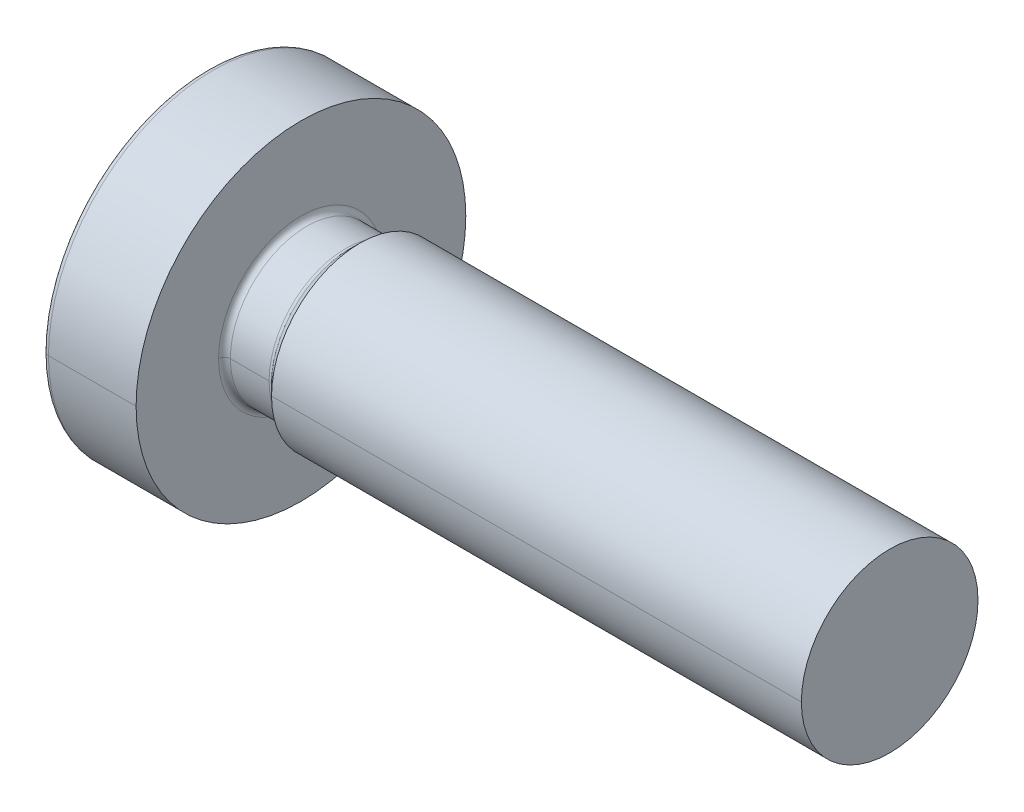
ISO-10303-21;
HEADER;
FILE_DESCRIPTION(('STEP AP214'),'2;1');
FILE_NAME('part.step','',(''),(''),'','','');
FILE_SCHEMA(('AUTOMOTIVE_DESIGN { 1 0 10303 214 1 1 1 1 }'));
ENDSEC;
DATA;
#1=APPLICATION_CONTEXT('core data for automotive mechanical design processes');
#2=APPLICATION_PROTOCOL_DEFINITION('international standard','automotive_design',2000,#1);
#3=PRODUCT_CONTEXT('',#1,'mechanical');
#4=PRODUCT('Part','Part','',(#3));
#5=PRODUCT_RELATED_PRODUCT_CATEGORY('part','',(#4));
#6=PRODUCT_DEFINITION_FORMATION('','',#4);
#7=PRODUCT_DEFINITION_CONTEXT('part definition',#1,'design');
#8=PRODUCT_DEFINITION('design','',#6,#7);
#9=PRODUCT_DEFINITION_SHAPE('','',#8);
#10=(LENGTH_UNIT() NAMED_UNIT(*) SI_UNIT(.MILLI.,.METRE.));
#11=(NAMED_UNIT(*) PLANE_ANGLE_UNIT() SI_UNIT($,.RADIAN.));
#12=(NAMED_UNIT(*) SI_UNIT($,.STERADIAN.) SOLID_ANGLE_UNIT());
#13=UNCERTAINTY_MEASURE_WITH_UNIT(LENGTH_MEASURE(1.E-05),#10,'distance_accuracy_value','');
#14=(GEOMETRIC_REPRESENTATION_CONTEXT(3) GLOBAL_UNCERTAINTY_ASSIGNED_CONTEXT((#13)) GLOBAL_UNIT_ASSIGNED_CONTEXT((#10,
#11,#12)) REPRESENTATION_CONTEXT('',''));
#15=CARTESIAN_POINT('',(0.,0.,0.));
#16=DIRECTION('',(0.,0.,1.));
#17=DIRECTION('',(1.,0.,0.));
#18=AXIS2_PLACEMENT_3D('',#15,#16,#17);
#19=CARTESIAN_POINT('',(2.5,0.,0.));
#20=DIRECTION('',(-1.,0.,0.));
#21=DIRECTION('',(0.,0.,1.));
#22=AXIS2_PLACEMENT_3D('',#19,#20,#21);
#23=TOROIDAL_SURFACE('',#22,1.399,0.1);
#24=CARTESIAN_POINT('',(2.4,0.,0.));
#25=DIRECTION('',(-1.,0.,0.));
#26=DIRECTION('',(0.,0.,1.));
#27=AXIS2_PLACEMENT_3D('',#24,#25,#26);
#28=CIRCLE('',#27,1.399);
#29=CARTESIAN_POINT('',(2.4,0.,-1.399));
#30=VERTEX_POINT('',#29);
#31=CARTESIAN_POINT('',(2.4,0.,1.399));
#32=VERTEX_POINT('',#31);
#33=EDGE_CURVE('E19',#30,#32,#28,.T.);
#34=ORIENTED_EDGE('',*,*,#33,.F.);
#35=CARTESIAN_POINT('',(2.5,0.,-1.399));
#36=DIRECTION('',(0.,1.,0.));
#37=DIRECTION('',(0.,0.,1.));
#38=AXIS2_PLACEMENT_3D('',#35,#36,#37);
#39=CIRCLE('',#38,0.1);
#40=CARTESIAN_POINT('',(2.5,0.,-1.299));
#41=VERTEX_POINT('',#40);
#42=EDGE_CURVE('E10',#30,#41,#39,.T.);
#43=ORIENTED_EDGE('',*,*,#42,.T.);
#44=CARTESIAN_POINT('',(2.5,0.,0.));
#45=DIRECTION('',(1.,0.,0.));
#46=DIRECTION('',(0.,0.,1.));
#47=AXIS2_PLACEMENT_3D('',#44,#45,#46);
#48=CIRCLE('',#47,1.299);
#49=CARTESIAN_POINT('',(2.5,0.,1.299));
#50=VERTEX_POINT('',#49);
#51=EDGE_CURVE('E231',#50,#41,#48,.T.);
#52=ORIENTED_EDGE('',*,*,#51,.F.);
#53=CARTESIAN_POINT('',(2.5,0.,1.399));
#54=DIRECTION('',(0.,-1.,0.));
#55=DIRECTION('',(0.,0.,-1.));
#56=AXIS2_PLACEMENT_3D('',#53,#54,#55);
#57=CIRCLE('',#56,0.1);
#58=EDGE_CURVE('E436',#32,#50,#57,.T.);
#59=ORIENTED_EDGE('',*,*,#58,.F.);
#60=EDGE_LOOP('',(#34,#43,#52,#59));
#61=FACE_BOUND('',#60,.T.);
#62=ADVANCED_FACE('F15',(#61),#23,.F.);
#63=CARTESIAN_POINT('',(3.15757864376269,0.,0.));
#64=DIRECTION('',(-1.,0.,0.));
#65=DIRECTION('',(0.,0.,1.));
#66=AXIS2_PLACEMENT_3D('',#63,#64,#65);
#67=TOROIDAL_SURFACE('',#66,1.399,0.1);
#68=CARTESIAN_POINT('',(3.15757864376269,0.,0.));
#69=DIRECTION('',(-1.,0.,0.));
#70=DIRECTION('',(0.,0.,1.));
#71=AXIS2_PLACEMENT_3D('',#68,#69,#70);
#72=CIRCLE('',#71,1.299);
#73=CARTESIAN_POINT('',(3.15757864376269,0.,-1.299));
#74=VERTEX_POINT('',#73);
#75=CARTESIAN_POINT('',(3.15757864376269,0.,1.299));
#76=VERTEX_POINT('',#75);
#77=EDGE_CURVE('E230',#74,#76,#72,.T.);
#78=ORIENTED_EDGE('',*,*,#77,.F.);
#79=CARTESIAN_POINT('',(3.15757864376269,0.,-1.399));
#80=DIRECTION('',(0.,1.,0.));
#81=DIRECTION('',(0.,0.,1.));
#82=AXIS2_PLACEMENT_3D('',#79,#80,#81);
#83=CIRCLE('',#82,0.1);
#84=CARTESIAN_POINT('',(3.22828932188135,0.,-1.32828932188134));
#85=VERTEX_POINT('',#84);
#86=EDGE_CURVE('E26',#74,#85,#83,.T.);
#87=ORIENTED_EDGE('',*,*,#86,.T.);
#88=CARTESIAN_POINT('',(3.22828932188135,0.,0.));
#89=DIRECTION('',(1.,0.,0.));
#90=DIRECTION('',(0.,0.,-1.));
#91=AXIS2_PLACEMENT_3D('',#88,#89,#90);
#92=CIRCLE('',#91,1.32828932188134);
#93=CARTESIAN_POINT('',(3.22828932188135,0.,1.32828932188134));
#94=VERTEX_POINT('',#93);
#95=EDGE_CURVE('E262',#94,#85,#92,.T.);
#96=ORIENTED_EDGE('',*,*,#95,.F.);
#97=CARTESIAN_POINT('',(3.15757864376269,0.,1.399));
#98=DIRECTION('',(0.,-1.,0.));
#99=DIRECTION('',(0.,0.,-1.));
#100=AXIS2_PLACEMENT_3D('',#97,#98,#99);
#101=CIRCLE('',#100,0.1);
#102=EDGE_CURVE('E297',#76,#94,#101,.T.);
#103=ORIENTED_EDGE('',*,*,#102,.F.);
#104=EDGE_LOOP('',(#78,#87,#96,#103));
#105=FACE_BOUND('',#104,.T.);
#106=ADVANCED_FACE('F583',(#105),#67,.F.);
#107=CARTESIAN_POINT('',(0.910990339947826,0.,0.));
#108=DIRECTION('',(1.,0.,0.));
#109=DIRECTION('',(0.,0.,-1.));
#110=AXIS2_PLACEMENT_3D('',#107,#108,#109);
#111=TOROIDAL_SURFACE('',#110,2.7,0.1);
#112=CARTESIAN_POINT('',(0.827541163212067,0.,0.));
#113=DIRECTION('',(-1.,0.,0.));
#114=DIRECTION('',(0.,0.,-1.));
#115=AXIS2_PLACEMENT_3D('',#112,#113,#114);
#116=CIRCLE('',#115,2.75510204081632);
#117=CARTESIAN_POINT('',(0.827541163212067,0.,2.75510204081632));
#118=VERTEX_POINT('',#117);
#119=CARTESIAN_POINT('',(0.827541163212066,2.75510204081632,0.));
#120=VERTEX_POINT('',#119);
#121=EDGE_CURVE('E388',#118,#120,#116,.T.);
#122=ORIENTED_EDGE('',*,*,#121,.F.);
#123=CARTESIAN_POINT('',(0.910990339947826,0.,2.7));
#124=DIRECTION('',(0.,1.,0.));
#125=DIRECTION('',(0.,0.,1.));
#126=AXIS2_PLACEMENT_3D('',#123,#124,#125);
#127=CIRCLE('',#126,0.1);
#128=CARTESIAN_POINT('',(0.910990339947826,0.,2.8));
#129=VERTEX_POINT('',#128);
#130=EDGE_CURVE('E285',#118,#129,#127,.T.);
#131=ORIENTED_EDGE('',*,*,#130,.T.);
#132=CARTESIAN_POINT('',(0.910990339947826,0.,0.));
#133=DIRECTION('',(1.,0.,0.));
#134=DIRECTION('',(0.,0.,-1.));
#135=AXIS2_PLACEMENT_3D('',#132,#133,#134);
#136=CIRCLE('',#135,2.8);
#137=CARTESIAN_POINT('',(0.910990339947826,0.,-2.8));
#138=VERTEX_POINT('',#137);
#139=EDGE_CURVE('E353',#138,#129,#136,.T.);
#140=ORIENTED_EDGE('',*,*,#139,.F.);
#141=CARTESIAN_POINT('',(0.910990339947826,0.,-2.7));
#142=DIRECTION('',(0.,-1.,0.));
#143=DIRECTION('',(0.,0.,-1.));
#144=AXIS2_PLACEMENT_3D('',#141,#142,#143);
#145=CIRCLE('',#144,0.1);
#146=CARTESIAN_POINT('',(0.827541163212067,0.,-2.75510204081632));
#147=VERTEX_POINT('',#146);
#148=EDGE_CURVE('E293',#147,#138,#145,.T.);
#149=ORIENTED_EDGE('',*,*,#148,.F.);
#150=CARTESIAN_POINT('',(0.827541163212067,0.,0.));
#151=DIRECTION('',(-1.,0.,0.));
#152=DIRECTION('',(0.,0.,-1.));
#153=AXIS2_PLACEMENT_3D('',#150,#151,#152);
#154=CIRCLE('',#153,2.75510204081632);
#155=EDGE_CURVE('E368',#120,#147,#154,.T.);
#156=ORIENTED_EDGE('',*,*,#155,.F.);
#157=EDGE_LOOP('',(#122,#131,#140,#149,#156));
#158=FACE_BOUND('',#157,.T.);
#159=ADVANCED_FACE('F588',(#158),#111,.T.);
#160=CARTESIAN_POINT('',(-3.4420013783492,0.,0.));
#161=DIRECTION('',(-1.,0.,0.));
#162=DIRECTION('',(0.,0.,1.));
#163=AXIS2_PLACEMENT_3D('',#160,#161,#162);
#164=CYLINDRICAL_SURFACE('',#163,1.5);
#165=CARTESIAN_POINT('',(12.4,0.,0.));
#166=DIRECTION('',(-1.,0.,0.));
#167=DIRECTION('',(0.,0.,1.));
#168=AXIS2_PLACEMENT_3D('',#165,#166,#167);
#169=CIRCLE('',#168,1.5);
#170=CARTESIAN_POINT('',(12.4,0.,1.5));
#171=VERTEX_POINT('',#170);
#172=CARTESIAN_POINT('',(12.4,0.,-1.5));
#173=VERTEX_POINT('',#172);
#174=EDGE_CURVE('E281',#171,#173,#169,.T.);
#175=ORIENTED_EDGE('',*,*,#174,.T.);
#176=DIRECTION('',(-1.,0.,0.));
#177=VECTOR('',#176,1.);
#178=CARTESIAN_POINT('',(-3.4420013783492,0.,-1.5));
#179=LINE('',#178,#177);
#180=CARTESIAN_POINT('',(3.4,0.,-1.5));
#181=VERTEX_POINT('',#180);
#182=EDGE_CURVE('E286',#173,#181,#179,.T.);
#183=ORIENTED_EDGE('',*,*,#182,.T.);
#184=CARTESIAN_POINT('',(3.4,0.,0.));
#185=DIRECTION('',(-1.,0.,0.));
#186=DIRECTION('',(0.,0.,1.));
#187=AXIS2_PLACEMENT_3D('',#184,#185,#186);
#188=CIRCLE('',#187,1.5);
#189=CARTESIAN_POINT('',(3.4,0.,1.5));
#190=VERTEX_POINT('',#189);
#191=EDGE_CURVE('E247',#190,#181,#188,.T.);
#192=ORIENTED_EDGE('',*,*,#191,.F.);
#193=DIRECTION('',(-1.,0.,0.));
#194=VECTOR('',#193,1.);
#195=CARTESIAN_POINT('',(-3.4420013783492,0.,1.5));
#196=LINE('',#195,#194);
#197=EDGE_CURVE('E296',#171,#190,#196,.T.);
#198=ORIENTED_EDGE('',*,*,#197,.F.);
#199=EDGE_LOOP('',(#175,#183,#192,#198));
#200=FACE_BOUND('',#199,.T.);
#201=ADVANCED_FACE('F608',(#200),#164,.T.);
#202=CARTESIAN_POINT('',(3.4,0.,0.));
#203=DIRECTION('',(1.,0.,0.));
#204=DIRECTION('',(0.,0.,-1.));
#205=AXIS2_PLACEMENT_3D('',#202,#203,#204);
#206=CONICAL_SURFACE('',#205,1.5,0.78539816339744);
#207=CARTESIAN_POINT('',(3.22828932188135,0.,0.));
#208=DIRECTION('',(1.,0.,0.));
#209=DIRECTION('',(0.,0.,-1.));
#210=AXIS2_PLACEMENT_3D('',#207,#208,#209);
#211=CIRCLE('',#210,1.32828932188134);
#212=EDGE_CURVE('E323',#85,#94,#211,.T.);
#213=ORIENTED_EDGE('',*,*,#212,.T.);
#214=DIRECTION('',(0.707106781186554,0.,0.707106781186541));
#215=VECTOR('',#214,1.);
#216=CARTESIAN_POINT('',(3.4,0.,1.5));
#217=LINE('',#216,#215);
#218=EDGE_CURVE('E251',#94,#190,#217,.T.);
#219=ORIENTED_EDGE('',*,*,#218,.T.);
#220=ORIENTED_EDGE('',*,*,#191,.T.);
#221=DIRECTION('',(0.707106781186554,0.,-0.707106781186541));
#222=VECTOR('',#221,1.);
#223=CARTESIAN_POINT('',(3.4,0.,-1.5));
#224=LINE('',#223,#222);
#225=EDGE_CURVE('E259',#85,#181,#224,.T.);
#226=ORIENTED_EDGE('',*,*,#225,.F.);
#227=EDGE_LOOP('',(#213,#219,#220,#226));
#228=FACE_BOUND('',#227,.T.);
#229=ADVANCED_FACE('F604',(#228),#206,.T.);
#230=CARTESIAN_POINT('',(-3.4420013783492,0.,0.));
#231=DIRECTION('',(-1.,0.,0.));
#232=DIRECTION('',(0.,0.,1.));
#233=AXIS2_PLACEMENT_3D('',#230,#231,#232);
#234=CYLINDRICAL_SURFACE('',#233,1.299);
#235=CARTESIAN_POINT('',(3.15757864376269,0.,0.));
#236=DIRECTION('',(-1.,0.,0.));
#237=DIRECTION('',(0.,0.,1.));
#238=AXIS2_PLACEMENT_3D('',#235,#236,#237);
#239=CIRCLE('',#238,1.299);
#240=EDGE_CURVE('E252',#76,#74,#239,.T.);
#241=ORIENTED_EDGE('',*,*,#240,.T.);
#242=DIRECTION('',(-1.,0.,0.));
#243=VECTOR('',#242,1.);
#244=CARTESIAN_POINT('',(-3.4420013783492,0.,-1.299));
#245=LINE('',#244,#243);
#246=EDGE_CURVE('E328',#74,#41,#245,.T.);
#247=ORIENTED_EDGE('',*,*,#246,.T.);
#248=CARTESIAN_POINT('',(2.5,0.,0.));
#249=DIRECTION('',(1.,0.,0.));
#250=DIRECTION('',(0.,0.,1.));
#251=AXIS2_PLACEMENT_3D('',#248,#249,#250);
#252=CIRCLE('',#251,1.299);
#253=EDGE_CURVE('E324',#41,#50,#252,.T.);
#254=ORIENTED_EDGE('',*,*,#253,.T.);
#255=DIRECTION('',(-1.,0.,0.));
#256=VECTOR('',#255,1.);
#257=CARTESIAN_POINT('',(-3.4420013783492,0.,1.299));
#258=LINE('',#257,#256);
#259=EDGE_CURVE('E226',#76,#50,#258,.T.);
#260=ORIENTED_EDGE('',*,*,#259,.F.);
#261=EDGE_LOOP('',(#241,#247,#254,#260));
#262=FACE_BOUND('',#261,.T.);
#263=ADVANCED_FACE('F607',(#262),#234,.T.);
#264=CARTESIAN_POINT('',(-3.4420013783492,0.,0.));
#265=DIRECTION('',(-1.,0.,0.));
#266=DIRECTION('',(0.,0.,1.));
#267=AXIS2_PLACEMENT_3D('',#264,#265,#266);
#268=CYLINDRICAL_SURFACE('',#267,2.8);
#269=CARTESIAN_POINT('',(2.4,0.,0.));
#270=DIRECTION('',(-1.,0.,0.));
#271=DIRECTION('',(0.,0.,1.));
#272=AXIS2_PLACEMENT_3D('',#269,#270,#271);
#273=CIRCLE('',#272,2.8);
#274=CARTESIAN_POINT('',(2.4,0.,2.8));
#275=VERTEX_POINT('',#274);
#276=CARTESIAN_POINT('',(2.4,0.,-2.8));
#277=VERTEX_POINT('',#276);
#278=EDGE_CURVE('E329',#275,#277,#273,.T.);
#279=ORIENTED_EDGE('',*,*,#278,.T.);
#280=DIRECTION('',(-1.,0.,0.));
#281=VECTOR('',#280,1.);
#282=CARTESIAN_POINT('',(-3.4420013783492,0.,-2.8));
#283=LINE('',#282,#281);
#284=EDGE_CURVE('E349',#277,#138,#283,.T.);
#285=ORIENTED_EDGE('',*,*,#284,.T.);
#286=ORIENTED_EDGE('',*,*,#139,.T.);
#287=DIRECTION('',(-1.,0.,0.));
#288=VECTOR('',#287,1.);
#289=CARTESIAN_POINT('',(-3.4420013783492,0.,2.8));
#290=LINE('',#289,#288);
#291=EDGE_CURVE('E305',#275,#129,#290,.T.);
#292=ORIENTED_EDGE('',*,*,#291,.F.);
#293=EDGE_LOOP('',(#279,#285,#286,#292));
#294=FACE_BOUND('',#293,.T.);
#295=ADVANCED_FACE('F667',(#294),#268,.T.);
#296=CARTESIAN_POINT('',(5.,0.,0.));
#297=DIRECTION('',(0.,0.,-1.));
#298=DIRECTION('',(0.,1.,0.));
#299=AXIS2_PLACEMENT_3D('',#296,#297,#298);
#300=SPHERICAL_SURFACE('',#299,5.);
#301=ORIENTED_EDGE('',*,*,#155,.T.);
#302=CARTESIAN_POINT('',(0.827541163212067,0.,0.));
#303=DIRECTION('',(-1.,0.,0.));
#304=DIRECTION('',(0.,0.,-1.));
#305=AXIS2_PLACEMENT_3D('',#302,#303,#304);
#306=CIRCLE('',#305,2.75510204081632);
#307=CARTESIAN_POINT('',(0.827541163212066,-2.75510204081632,0.));
#308=VERTEX_POINT('',#307);
#309=EDGE_CURVE('E279',#147,#308,#306,.T.);
#310=ORIENTED_EDGE('',*,*,#309,.T.);
#311=CARTESIAN_POINT('',(5.,0.,0.));
#312=DIRECTION('',(0.,0.,-1.));
#313=DIRECTION('',(0.,1.,0.));
#314=AXIS2_PLACEMENT_3D('',#311,#312,#313);
#315=CIRCLE('',#314,5.);
#316=CARTESIAN_POINT('',(0.0483882559325496,-0.693931650822548,0.));
#317=VERTEX_POINT('',#316);
#318=EDGE_CURVE('E275',#308,#317,#315,.T.);
#319=ORIENTED_EDGE('',*,*,#318,.T.);
#320=CARTESIAN_POINT('',(5.00907871968526,-0.073940238239228,0.0283829982019893));
#321=DIRECTION('',(0.113883497498907,-0.927506656060475,0.356036447517571));
#322=DIRECTION('',(0.,-0.358367949545293,-0.933580426497205));
#323=AXIS2_PLACEMENT_3D('',#320,#321,#322);
#324=CIRCLE('',#323,4.9993644419497);
#325=CARTESIAN_POINT('',(0.0743133377131422,-0.805315831954644,-0.298458231192017));
#326=VERTEX_POINT('',#325);
#327=EDGE_CURVE('E280',#317,#326,#324,.T.);
#328=ORIENTED_EDGE('',*,*,#327,.T.);
#329=CARTESIAN_POINT('',(4.99447111284247,0.0450291723721179,-0.0434841662986069));
#330=DIRECTION('',(0.0879813128153511,-0.716550290756221,0.691964572368025));
#331=DIRECTION('',(0.,-0.694658370458996,-0.719339800338653));
#332=AXIS2_PLACEMENT_3D('',#329,#330,#331);
#333=CIRCLE('',#332,4.99960507763599);
#334=CARTESIAN_POINT('',(0.212229293358308,-1.22830113216143,-0.754007950458526));
#335=VERTEX_POINT('',#334);
#336=EDGE_CURVE('E291',#326,#335,#333,.T.);
#337=ORIENTED_EDGE('',*,*,#336,.T.);
#338=CARTESIAN_POINT('',(4.60651618361134,0.558053223935769,0.55805322393577));
#339=DIRECTION('',(-0.446197814505031,0.632814155313759,0.63281415531376));
#340=DIRECTION('',(0.,-0.707106781186548,0.707106781186547));
#341=AXIS2_PLACEMENT_3D('',#338,#339,#340);
#342=CIRCLE('',#341,4.92161799459791);
#343=CARTESIAN_POINT('',(0.212229294438488,-0.754007950138534,-1.22830113171978));
#344=VERTEX_POINT('',#343);
#345=EDGE_CURVE('E417',#344,#335,#342,.T.);
#346=ORIENTED_EDGE('',*,*,#345,.F.);
#347=CARTESIAN_POINT('',(4.99447111284247,-0.0434841662986056,0.0450291723721165));
#348=DIRECTION('',(0.0879813128153507,0.691964572368025,-0.716550290756221));
#349=DIRECTION('',(0.,0.719339800338653,0.694658370458996));
#350=AXIS2_PLACEMENT_3D('',#347,#348,#349);
#351=CIRCLE('',#350,4.99960507763599);
#352=CARTESIAN_POINT('',(0.0743133377131075,-0.298458231192018,-0.805315831954648));
#353=VERTEX_POINT('',#352);
#354=EDGE_CURVE('E287',#344,#353,#351,.T.);
#355=ORIENTED_EDGE('',*,*,#354,.T.);
#356=CARTESIAN_POINT('',(5.00907871968526,0.0283829982019898,-0.0739402382392289));
#357=DIRECTION('',(0.113883497498906,0.356036447517571,-0.927506656060475));
#358=DIRECTION('',(0.,0.933580426497205,0.358367949545293));
#359=AXIS2_PLACEMENT_3D('',#356,#357,#358);
#360=CIRCLE('',#359,4.9993644419497);
#361=CARTESIAN_POINT('',(0.04838825593255,0.,-0.693931650822548));
#362=VERTEX_POINT('',#361);
#363=EDGE_CURVE('E292',#353,#362,#360,.T.);
#364=ORIENTED_EDGE('',*,*,#363,.T.);
#365=CARTESIAN_POINT('',(5.00907871968526,-0.0283829982019896,-0.0739402382392284));
#366=DIRECTION('',(0.113883497498906,-0.356036447517572,-0.927506656060475));
#367=DIRECTION('',(0.,0.933580426497204,-0.358367949545294));
#368=AXIS2_PLACEMENT_3D('',#365,#366,#367);
#369=CIRCLE('',#368,4.9993644419497);
#370=CARTESIAN_POINT('',(0.0743133377131416,0.298458231192017,-0.805315831954644));
#371=VERTEX_POINT('',#370);
#372=EDGE_CURVE('E245',#362,#371,#369,.T.);
#373=ORIENTED_EDGE('',*,*,#372,.T.);
#374=CARTESIAN_POINT('',(4.99447111284247,0.043484166298606,0.0450291723721169));
#375=DIRECTION('',(0.0879813128153509,-0.691964572368024,-0.716550290756221));
#376=DIRECTION('',(0.,0.719339800338653,-0.694658370458996));
#377=AXIS2_PLACEMENT_3D('',#374,#375,#376);
#378=CIRCLE('',#377,4.99960507763599);
#379=CARTESIAN_POINT('',(0.212229293358308,0.754007950458526,-1.22830113216143));
#380=VERTEX_POINT('',#379);
#381=EDGE_CURVE('E241',#371,#380,#378,.T.);
#382=ORIENTED_EDGE('',*,*,#381,.T.);
#383=CARTESIAN_POINT('',(4.60651618361134,-0.558053223935769,0.558053223935769));
#384=DIRECTION('',(-0.446197814505031,-0.63281415531376,0.63281415531376));
#385=DIRECTION('',(0.,-0.707106781186548,-0.707106781186547));
#386=AXIS2_PLACEMENT_3D('',#383,#384,#385);
#387=CIRCLE('',#386,4.92161799459791);
#388=CARTESIAN_POINT('',(0.212229293358308,1.22830113216143,-0.754007950458526));
#389=VERTEX_POINT('',#388);
#390=EDGE_CURVE('E313',#389,#380,#387,.T.);
#391=ORIENTED_EDGE('',*,*,#390,.F.);
#392=CARTESIAN_POINT('',(4.99447111284247,-0.0450291723721175,-0.0434841662986066));
#393=DIRECTION('',(0.087981312815351,0.716550290756221,0.691964572368025));
#394=DIRECTION('',(0.,-0.694658370458996,0.719339800338653));
#395=AXIS2_PLACEMENT_3D('',#392,#393,#394);
#396=CIRCLE('',#395,4.99960507763599);
#397=CARTESIAN_POINT('',(0.0743133377131069,0.805315831954649,-0.298458231192017));
#398=VERTEX_POINT('',#397);
#399=EDGE_CURVE('E246',#389,#398,#396,.T.);
#400=ORIENTED_EDGE('',*,*,#399,.T.);
#401=CARTESIAN_POINT('',(5.00907871968526,0.0739402382392284,0.0283829982019895));
#402=DIRECTION('',(0.113883497498906,0.927506656060475,0.356036447517571));
#403=DIRECTION('',(0.,-0.358367949545293,0.933580426497205));
#404=AXIS2_PLACEMENT_3D('',#401,#402,#403);
#405=CIRCLE('',#404,4.9993644419497);
#406=CARTESIAN_POINT('',(0.0483882559325506,0.693931650822548,0.));
#407=VERTEX_POINT('',#406);
#408=EDGE_CURVE('E405',#398,#407,#405,.T.);
#409=ORIENTED_EDGE('',*,*,#408,.T.);
#410=CARTESIAN_POINT('',(5.,0.,0.));
#411=DIRECTION('',(0.,0.,1.));
#412=DIRECTION('',(1.,0.,0.));
#413=AXIS2_PLACEMENT_3D('',#410,#411,#412);
#414=CIRCLE('',#413,5.);
#415=EDGE_CURVE('E392',#120,#407,#414,.T.);
#416=ORIENTED_EDGE('',*,*,#415,.F.);
#417=EDGE_LOOP('',(#301,#310,#319,#328,#337,#346,#355,#364,#373,#382,#391,#400,#409,#416));
#418=FACE_BOUND('',#417,.T.);
#419=ADVANCED_FACE('F567',(#418),#300,.T.);
#420=CARTESIAN_POINT('',(5.,0.,0.));
#421=DIRECTION('',(0.,0.,-1.));
#422=DIRECTION('',(0.,1.,0.));
#423=AXIS2_PLACEMENT_3D('',#420,#421,#422);
#424=SPHERICAL_SURFACE('',#423,5.);
#425=ORIENTED_EDGE('',*,*,#318,.F.);
#426=CARTESIAN_POINT('',(0.827541163212067,0.,0.));
#427=DIRECTION('',(-1.,0.,0.));
#428=DIRECTION('',(0.,0.,-1.));
#429=AXIS2_PLACEMENT_3D('',#426,#427,#428);
#430=CIRCLE('',#429,2.75510204081632);
#431=EDGE_CURVE('E391',#308,#118,#430,.T.);
#432=ORIENTED_EDGE('',*,*,#431,.T.);
#433=ORIENTED_EDGE('',*,*,#121,.T.);
#434=ORIENTED_EDGE('',*,*,#415,.T.);
#435=CARTESIAN_POINT('',(5.00907871968526,0.0739402382392284,-0.0283829982019895));
#436=DIRECTION('',(0.113883497498906,0.927506656060475,-0.356036447517571));
#437=DIRECTION('',(0.,0.358367949545293,0.933580426497205));
#438=AXIS2_PLACEMENT_3D('',#435,#436,#437);
#439=CIRCLE('',#438,4.9993644419497);
#440=CARTESIAN_POINT('',(0.0743133377131422,0.805315831954644,0.298458231192017));
#441=VERTEX_POINT('',#440);
#442=EDGE_CURVE('E446',#407,#441,#439,.T.);
#443=ORIENTED_EDGE('',*,*,#442,.T.);
#444=CARTESIAN_POINT('',(4.99447111284247,-0.0450291723721173,0.0434841662986063));
#445=DIRECTION('',(0.0879813128153509,0.716550290756221,-0.691964572368025));
#446=DIRECTION('',(0.,0.694658370458996,0.719339800338653));
#447=AXIS2_PLACEMENT_3D('',#444,#445,#446);
#448=CIRCLE('',#447,4.99960507763599);
#449=CARTESIAN_POINT('',(0.212229293358308,1.22830113216143,0.754007950458526));
#450=VERTEX_POINT('',#449);
#451=EDGE_CURVE('E383',#441,#450,#448,.T.);
#452=ORIENTED_EDGE('',*,*,#451,.T.);
#453=CARTESIAN_POINT('',(4.60651618361134,-0.558053223935769,-0.55805322393577));
#454=DIRECTION('',(-0.446197814505031,-0.63281415531376,-0.63281415531376));
#455=DIRECTION('',(0.,0.707106781186548,-0.707106781186547));
#456=AXIS2_PLACEMENT_3D('',#453,#454,#455);
#457=CIRCLE('',#456,4.92161799459792);
#458=CARTESIAN_POINT('',(0.212229294438488,0.754007950138533,1.22830113171978));
#459=VERTEX_POINT('',#458);
#460=EDGE_CURVE('E264',#459,#450,#457,.T.);
#461=ORIENTED_EDGE('',*,*,#460,.F.);
#462=CARTESIAN_POINT('',(4.99447111284247,0.043484166298606,-0.0450291723721169));
#463=DIRECTION('',(0.0879813128153509,-0.691964572368024,0.716550290756221));
#464=DIRECTION('',(0.,-0.719339800338653,-0.694658370458996));
#465=AXIS2_PLACEMENT_3D('',#462,#463,#464);
#466=CIRCLE('',#465,4.99960507763599);
#467=CARTESIAN_POINT('',(0.0743133377131075,0.298458231192017,0.805315831954648));
#468=VERTEX_POINT('',#467);
#469=EDGE_CURVE('E379',#459,#468,#466,.T.);
#470=ORIENTED_EDGE('',*,*,#469,.T.);
#471=CARTESIAN_POINT('',(5.00907871968526,-0.0283829982019896,0.0739402382392284));
#472=DIRECTION('',(0.113883497498906,-0.356036447517572,0.927506656060475));
#473=DIRECTION('',(0.,-0.933580426497204,-0.358367949545294));
#474=AXIS2_PLACEMENT_3D('',#471,#472,#473);
#475=CIRCLE('',#474,4.9993644419497);
#476=CARTESIAN_POINT('',(0.0483882559325501,0.,0.693931650822548));
#477=VERTEX_POINT('',#476);
#478=EDGE_CURVE('E384',#468,#477,#475,.T.);
#479=ORIENTED_EDGE('',*,*,#478,.T.);
#480=CARTESIAN_POINT('',(5.00907871968526,0.0283829982019898,0.0739402382392289));
#481=DIRECTION('',(0.113883497498906,0.356036447517571,0.927506656060475));
#482=DIRECTION('',(0.,-0.933580426497205,0.358367949545293));
#483=AXIS2_PLACEMENT_3D('',#480,#481,#482);
#484=CIRCLE('',#483,4.9993644419497);
#485=CARTESIAN_POINT('',(0.0743133377131421,-0.298458231192018,0.805315831954644));
#486=VERTEX_POINT('',#485);
#487=EDGE_CURVE('E356',#477,#486,#484,.T.);
#488=ORIENTED_EDGE('',*,*,#487,.T.);
#489=CARTESIAN_POINT('',(4.99447111284247,-0.0434841662986054,-0.0450291723721164));
#490=DIRECTION('',(0.0879813128153507,0.691964572368024,0.716550290756221));
#491=DIRECTION('',(0.,-0.719339800338653,0.694658370458996));
#492=AXIS2_PLACEMENT_3D('',#489,#490,#491);
#493=CIRCLE('',#492,4.99960507763599);
#494=CARTESIAN_POINT('',(0.212229293358308,-0.754007950458526,1.22830113216143));
#495=VERTEX_POINT('',#494);
#496=EDGE_CURVE('E207',#486,#495,#493,.T.);
#497=ORIENTED_EDGE('',*,*,#496,.T.);
#498=CARTESIAN_POINT('',(4.60651618361134,0.558053223935768,-0.558053223935769));
#499=DIRECTION('',(-0.446197814505031,0.632814155313759,-0.63281415531376));
#500=DIRECTION('',(0.,0.707106781186548,0.707106781186547));
#501=AXIS2_PLACEMENT_3D('',#498,#499,#500);
#502=CIRCLE('',#501,4.92161799459792);
#503=CARTESIAN_POINT('',(0.212229294438489,-1.22830113171978,0.754007950138533));
#504=VERTEX_POINT('',#503);
#505=EDGE_CURVE('E203',#504,#495,#502,.T.);
#506=ORIENTED_EDGE('',*,*,#505,.F.);
#507=CARTESIAN_POINT('',(4.99447111284247,0.0450291723721179,0.0434841662986069));
#508=DIRECTION('',(0.0879813128153511,-0.716550290756221,-0.691964572368025));
#509=DIRECTION('',(0.,0.694658370458996,-0.719339800338653));
#510=AXIS2_PLACEMENT_3D('',#507,#508,#509);
#511=CIRCLE('',#510,4.99960507763599);
#512=CARTESIAN_POINT('',(0.0743133377131069,-0.805315831954648,0.298458231192017));
#513=VERTEX_POINT('',#512);
#514=EDGE_CURVE('E198',#504,#513,#511,.T.);
#515=ORIENTED_EDGE('',*,*,#514,.T.);
#516=CARTESIAN_POINT('',(5.00907871968526,-0.0739402382392281,-0.0283829982019894));
#517=DIRECTION('',(0.113883497498907,-0.927506656060475,-0.356036447517571));
#518=DIRECTION('',(0.,0.358367949545293,-0.933580426497205));
#519=AXIS2_PLACEMENT_3D('',#516,#517,#518);
#520=CIRCLE('',#519,4.9993644419497);
#521=EDGE_CURVE('E186',#513,#317,#520,.T.);
#522=ORIENTED_EDGE('',*,*,#521,.T.);
#523=EDGE_LOOP('',(#425,#432,#433,#434,#443,#452,#461,#470,#479,#488,#497,#506,#515,#522));
#524=FACE_BOUND('',#523,.T.);
#525=ADVANCED_FACE('F17',(#524),#424,.T.);
#526=CARTESIAN_POINT('',(-3.4420013783492,0.,0.));
#527=DIRECTION('',(-1.,0.,0.));
#528=DIRECTION('',(0.,0.,1.));
#529=AXIS2_PLACEMENT_3D('',#526,#527,#528);
#530=CYLINDRICAL_SURFACE('',#529,2.8);
#531=ORIENTED_EDGE('',*,*,#284,.F.);
#532=CARTESIAN_POINT('',(2.4,0.,0.));
#533=DIRECTION('',(-1.,0.,0.));
#534=DIRECTION('',(0.,0.,1.));
#535=AXIS2_PLACEMENT_3D('',#532,#533,#534);
#536=CIRCLE('',#535,2.8);
#537=EDGE_CURVE('E199',#277,#275,#536,.T.);
#538=ORIENTED_EDGE('',*,*,#537,.T.);
#539=ORIENTED_EDGE('',*,*,#291,.T.);
#540=CARTESIAN_POINT('',(0.910990339947826,0.,0.));
#541=DIRECTION('',(1.,0.,0.));
#542=DIRECTION('',(0.,0.,-1.));
#543=AXIS2_PLACEMENT_3D('',#540,#541,#542);
#544=CIRCLE('',#543,2.8);
#545=EDGE_CURVE('E308',#129,#138,#544,.T.);
#546=ORIENTED_EDGE('',*,*,#545,.T.);
#547=EDGE_LOOP('',(#531,#538,#539,#546));
#548=FACE_BOUND('',#547,.T.);
#549=ADVANCED_FACE('F637',(#548),#530,.T.);
#550=CARTESIAN_POINT('',(2.4,2.8,0.));
#551=DIRECTION('',(-1.,0.,0.));
#552=DIRECTION('',(0.,0.,1.));
#553=AXIS2_PLACEMENT_3D('',#550,#551,#552);
#554=PLANE('',#553);
#555=ORIENTED_EDGE('',*,*,#278,.F.);
#556=ORIENTED_EDGE('',*,*,#537,.F.);
#557=EDGE_LOOP('',(#555,#556));
#558=FACE_BOUND('',#557,.T.);
#559=CARTESIAN_POINT('',(2.4,0.,0.));
#560=DIRECTION('',(-1.,0.,0.));
#561=DIRECTION('',(0.,0.,1.));
#562=AXIS2_PLACEMENT_3D('',#559,#560,#561);
#563=CIRCLE('',#562,1.399);
#564=EDGE_CURVE('E378',#32,#30,#563,.T.);
#565=ORIENTED_EDGE('',*,*,#564,.T.);
#566=ORIENTED_EDGE('',*,*,#33,.T.);
#567=EDGE_LOOP('',(#565,#566));
#568=FACE_BOUND('',#567,.T.);
#569=ADVANCED_FACE('F598',(#558,#568),#554,.F.);
#570=CARTESIAN_POINT('',(-3.4420013783492,0.,0.));
#571=DIRECTION('',(-1.,0.,0.));
#572=DIRECTION('',(0.,0.,1.));
#573=AXIS2_PLACEMENT_3D('',#570,#571,#572);
#574=CYLINDRICAL_SURFACE('',#573,1.299);
#575=ORIENTED_EDGE('',*,*,#246,.F.);
#576=ORIENTED_EDGE('',*,*,#77,.T.);
#577=ORIENTED_EDGE('',*,*,#259,.T.);
#578=ORIENTED_EDGE('',*,*,#51,.T.);
#579=EDGE_LOOP('',(#575,#576,#577,#578));
#580=FACE_BOUND('',#579,.T.);
#581=ADVANCED_FACE('F594',(#580),#574,.T.);
#582=CARTESIAN_POINT('',(3.4,0.,0.));
#583=DIRECTION('',(1.,0.,0.));
#584=DIRECTION('',(0.,0.,-1.));
#585=AXIS2_PLACEMENT_3D('',#582,#583,#584);
#586=CONICAL_SURFACE('',#585,1.5,0.78539816339744);
#587=ORIENTED_EDGE('',*,*,#218,.F.);
#588=ORIENTED_EDGE('',*,*,#95,.T.);
#589=ORIENTED_EDGE('',*,*,#225,.T.);
#590=CARTESIAN_POINT('',(3.4,0.,0.));
#591=DIRECTION('',(-1.,0.,0.));
#592=DIRECTION('',(0.,0.,1.));
#593=AXIS2_PLACEMENT_3D('',#590,#591,#592);
#594=CIRCLE('',#593,1.5);
#595=EDGE_CURVE('E263',#181,#190,#594,.T.);
#596=ORIENTED_EDGE('',*,*,#595,.T.);
#597=EDGE_LOOP('',(#587,#588,#589,#596));
#598=FACE_BOUND('',#597,.T.);
#599=ADVANCED_FACE('F597',(#598),#586,.T.);
#600=CARTESIAN_POINT('',(-3.4420013783492,0.,0.));
#601=DIRECTION('',(-1.,0.,0.));
#602=DIRECTION('',(0.,0.,1.));
#603=AXIS2_PLACEMENT_3D('',#600,#601,#602);
#604=CYLINDRICAL_SURFACE('',#603,1.5);
#605=ORIENTED_EDGE('',*,*,#182,.F.);
#606=CARTESIAN_POINT('',(12.4,0.,0.));
#607=DIRECTION('',(-1.,0.,0.));
#608=DIRECTION('',(0.,0.,1.));
#609=AXIS2_PLACEMENT_3D('',#606,#607,#608);
#610=CIRCLE('',#609,1.5);
#611=EDGE_CURVE('E301',#173,#171,#610,.T.);
#612=ORIENTED_EDGE('',*,*,#611,.T.);
#613=ORIENTED_EDGE('',*,*,#197,.T.);
#614=ORIENTED_EDGE('',*,*,#595,.F.);
#615=EDGE_LOOP('',(#605,#612,#613,#614));
#616=FACE_BOUND('',#615,.T.);
#617=ADVANCED_FACE('F602',(#616),#604,.T.);
#618=CARTESIAN_POINT('',(12.4,0.,0.));
#619=DIRECTION('',(-1.,0.,0.));
#620=DIRECTION('',(0.,0.,1.));
#621=AXIS2_PLACEMENT_3D('',#618,#619,#620);
#622=PLANE('',#621);
#623=ORIENTED_EDGE('',*,*,#174,.F.);
#624=ORIENTED_EDGE('',*,*,#611,.F.);
#625=EDGE_LOOP('',(#623,#624));
#626=FACE_BOUND('',#625,.T.);
#627=ADVANCED_FACE('F614',(#626),#622,.F.);
#628=CARTESIAN_POINT('',(0.910990339947826,0.,0.));
#629=DIRECTION('',(1.,0.,0.));
#630=DIRECTION('',(0.,0.,-1.));
#631=AXIS2_PLACEMENT_3D('',#628,#629,#630);
#632=TOROIDAL_SURFACE('',#631,2.7,0.1);
#633=ORIENTED_EDGE('',*,*,#130,.F.);
#634=ORIENTED_EDGE('',*,*,#431,.F.);
#635=ORIENTED_EDGE('',*,*,#309,.F.);
#636=ORIENTED_EDGE('',*,*,#148,.T.);
#637=ORIENTED_EDGE('',*,*,#545,.F.);
#638=EDGE_LOOP('',(#633,#634,#635,#636,#637));
#639=FACE_BOUND('',#638,.T.);
#640=ADVANCED_FACE('F610',(#639),#632,.T.);
#641=CARTESIAN_POINT('',(3.15757864376269,0.,0.));
#642=DIRECTION('',(-1.,0.,0.));
#643=DIRECTION('',(0.,0.,1.));
#644=AXIS2_PLACEMENT_3D('',#641,#642,#643);
#645=TOROIDAL_SURFACE('',#644,1.399,0.1);
#646=ORIENTED_EDGE('',*,*,#86,.F.);
#647=ORIENTED_EDGE('',*,*,#240,.F.);
#648=ORIENTED_EDGE('',*,*,#102,.T.);
#649=ORIENTED_EDGE('',*,*,#212,.F.);
#650=EDGE_LOOP('',(#646,#647,#648,#649));
#651=FACE_BOUND('',#650,.T.);
#652=ADVANCED_FACE('F613',(#651),#645,.F.);
#653=CARTESIAN_POINT('',(2.5,0.,0.));
#654=DIRECTION('',(-1.,0.,0.));
#655=DIRECTION('',(0.,0.,1.));
#656=AXIS2_PLACEMENT_3D('',#653,#654,#655);
#657=TOROIDAL_SURFACE('',#656,1.399,0.1);
#658=ORIENTED_EDGE('',*,*,#42,.F.);
#659=ORIENTED_EDGE('',*,*,#564,.F.);
#660=ORIENTED_EDGE('',*,*,#58,.T.);
#661=ORIENTED_EDGE('',*,*,#253,.F.);
#662=EDGE_LOOP('',(#658,#659,#660,#661));
#663=FACE_BOUND('',#662,.T.);
#664=ADVANCED_FACE('F660',(#663),#657,.F.);
#665=CARTESIAN_POINT('',(0.,1.31507331423074,-0.816878828796849));
#666=DIRECTION('',(0.087981312815351,0.716550290756221,0.691964572368024));
#667=DIRECTION('',(0.992013508213441,0.,-0.126131675332015));
#668=AXIS2_PLACEMENT_3D('',#665,#666,#667);
#669=PLANE('',#668);
#670=DIRECTION('',(-0.892670261136446,0.364977639050131,-0.264444942995667));
#671=VECTOR('',#670,1.);
#672=CARTESIAN_POINT('',(0.875,0.95732034757282,-0.557668529994433));
#673=LINE('',#672,#671);
#674=CARTESIAN_POINT('',(1.75,0.599567380914899,-0.298458231192017));
#675=VERTEX_POINT('',#674);
#676=EDGE_CURVE('E357',#675,#389,#673,.T.);
#677=ORIENTED_EDGE('',*,*,#676,.F.);
#678=DIRECTION('',(0.992546151641322,-0.121869343405147,0.));
#679=VECTOR('',#678,1.);
#680=CARTESIAN_POINT('',(0.875,0.70700387170494,-0.298458231192017));
#681=LINE('',#680,#679);
#682=EDGE_CURVE('E426',#398,#675,#681,.T.);
#683=ORIENTED_EDGE('',*,*,#682,.F.);
#684=ORIENTED_EDGE('',*,*,#399,.F.);
#685=EDGE_LOOP('',(#677,#683,#684));
#686=FACE_BOUND('',#685,.T.);
#687=ADVANCED_FACE('F619',(#686),#669,.F.);
#688=CARTESIAN_POINT('',(0.,0.699872981580083,0.));
#689=DIRECTION('',(0.113883497498906,0.927506656060475,0.356036447517571));
#690=DIRECTION('',(0.952461542619365,0.,-0.304658841708457));
#691=AXIS2_PLACEMENT_3D('',#688,#689,#690);
#692=PLANE('',#691);
#693=ORIENTED_EDGE('',*,*,#682,.T.);
#694=DIRECTION('',(0.,-0.358367949545295,0.933580426497204));
#695=VECTOR('',#694,1.);
#696=CARTESIAN_POINT('',(1.75,0.485,0.));
#697=LINE('',#696,#695);
#698=CARTESIAN_POINT('',(1.75,0.485,0.));
#699=VERTEX_POINT('',#698);
#700=EDGE_CURVE('E420',#675,#699,#697,.T.);
#701=ORIENTED_EDGE('',*,*,#700,.T.);
#702=DIRECTION('',(0.992546151641322,-0.121869343405147,0.));
#703=VECTOR('',#702,1.);
#704=CARTESIAN_POINT('',(0.,0.699872981580083,0.));
#705=LINE('',#704,#703);
#706=EDGE_CURVE('E361',#407,#699,#705,.T.);
#707=ORIENTED_EDGE('',*,*,#706,.F.);
#708=ORIENTED_EDGE('',*,*,#408,.F.);
#709=EDGE_LOOP('',(#693,#701,#707,#708));
#710=FACE_BOUND('',#709,.T.);
#711=ADVANCED_FACE('F616',(#710),#692,.F.);
#712=CARTESIAN_POINT('',(1.75,0.599567380914899,-0.298458231192017));
#713=DIRECTION('',(-0.446197814505031,-0.632814155313759,0.63281415531376));
#714=DIRECTION('',(-0.817268653268361,0.576256842375794,0.));
#715=AXIS2_PLACEMENT_3D('',#712,#713,#714);
#716=PLANE('',#715);
#717=ORIENTED_EDGE('',*,*,#390,.T.);
#718=DIRECTION('',(0.892670261136446,-0.264444942995668,0.364977639050131));
#719=VECTOR('',#718,1.);
#720=CARTESIAN_POINT('',(0.875,0.557668529994433,-0.95732034757282));
#721=LINE('',#720,#719);
#722=CARTESIAN_POINT('',(1.75,0.298458231192017,-0.599567380914899));
#723=VERTEX_POINT('',#722);
#724=EDGE_CURVE('E309',#380,#723,#721,.T.);
#725=ORIENTED_EDGE('',*,*,#724,.T.);
#726=DIRECTION('',(0.,0.707106781186548,0.707106781186547));
#727=VECTOR('',#726,1.);
#728=CARTESIAN_POINT('',(1.75,0.599567380914899,-0.298458231192017));
#729=LINE('',#728,#727);
#730=EDGE_CURVE('E314',#723,#675,#729,.T.);
#731=ORIENTED_EDGE('',*,*,#730,.T.);
#732=ORIENTED_EDGE('',*,*,#676,.T.);
#733=EDGE_LOOP('',(#717,#725,#731,#732));
#734=FACE_BOUND('',#733,.T.);
#735=ADVANCED_FACE('F618',(#734),#716,.T.);
#736=CARTESIAN_POINT('',(0.,0.699872981580083,0.));
#737=DIRECTION('',(0.113883497498906,0.927506656060475,-0.356036447517571));
#738=DIRECTION('',(-0.952461542619365,0.,-0.304658841708457));
#739=AXIS2_PLACEMENT_3D('',#736,#737,#738);
#740=PLANE('',#739);
#741=ORIENTED_EDGE('',*,*,#706,.T.);
#742=DIRECTION('',(0.,0.358367949545295,0.933580426497204));
#743=VECTOR('',#742,1.);
#744=CARTESIAN_POINT('',(1.75,0.485,0.));
#745=LINE('',#744,#743);
#746=CARTESIAN_POINT('',(1.75,0.599567380914899,0.298458231192017));
#747=VERTEX_POINT('',#746);
#748=EDGE_CURVE('E442',#699,#747,#745,.T.);
#749=ORIENTED_EDGE('',*,*,#748,.T.);
#750=DIRECTION('',(0.992546151641322,-0.121869343405147,0.));
#751=VECTOR('',#750,1.);
#752=CARTESIAN_POINT('',(0.,0.814440362494981,0.298458231192017));
#753=LINE('',#752,#751);
#754=EDGE_CURVE('E267',#441,#747,#753,.T.);
#755=ORIENTED_EDGE('',*,*,#754,.F.);
#756=ORIENTED_EDGE('',*,*,#442,.F.);
#757=EDGE_LOOP('',(#741,#749,#755,#756));
#758=FACE_BOUND('',#757,.T.);
#759=ADVANCED_FACE('F647',(#758),#740,.F.);
#760=CARTESIAN_POINT('',(0.,0.814440362494981,0.298458231192017));
#761=DIRECTION('',(0.087981312815351,0.716550290756221,-0.691964572368025));
#762=DIRECTION('',(-0.992013508213441,0.,-0.126131675332015));
#763=AXIS2_PLACEMENT_3D('',#760,#761,#762);
#764=PLANE('',#763);
#765=ORIENTED_EDGE('',*,*,#754,.T.);
#766=DIRECTION('',(0.892670261136446,-0.364977639050131,-0.264444942995668));
#767=VECTOR('',#766,1.);
#768=CARTESIAN_POINT('',(0.875,0.95732034757282,0.557668529994433));
#769=LINE('',#768,#767);
#770=EDGE_CURVE('E268',#450,#747,#769,.T.);
#771=ORIENTED_EDGE('',*,*,#770,.F.);
#772=ORIENTED_EDGE('',*,*,#451,.F.);
#773=EDGE_LOOP('',(#765,#771,#772));
#774=FACE_BOUND('',#773,.T.);
#775=ADVANCED_FACE('F650',(#774),#764,.F.);
#776=CARTESIAN_POINT('',(1.75,0.298458231192017,0.599567380914899));
#777=DIRECTION('',(-0.446197814505031,-0.632814155313759,-0.63281415531376));
#778=DIRECTION('',(0.,-0.707106781186548,0.707106781186547));
#779=AXIS2_PLACEMENT_3D('',#776,#777,#778);
#780=PLANE('',#779);
#781=ORIENTED_EDGE('',*,*,#460,.T.);
#782=ORIENTED_EDGE('',*,*,#770,.T.);
#783=DIRECTION('',(0.,-0.707106781186548,0.707106781186547));
#784=VECTOR('',#783,1.);
#785=CARTESIAN_POINT('',(1.75,0.599567380914899,0.298458231192017));
#786=LINE('',#785,#784);
#787=CARTESIAN_POINT('',(1.75,0.298458231192017,0.599567380914899));
#788=VERTEX_POINT('',#787);
#789=EDGE_CURVE('E239',#747,#788,#786,.T.);
#790=ORIENTED_EDGE('',*,*,#789,.T.);
#791=DIRECTION('',(-0.892670261136446,0.264444942995668,0.364977639050131));
#792=VECTOR('',#791,1.);
#793=CARTESIAN_POINT('',(0.875,0.557668529994433,0.95732034757282));
#794=LINE('',#793,#792);
#795=EDGE_CURVE('E235',#788,#459,#794,.T.);
#796=ORIENTED_EDGE('',*,*,#795,.T.);
#797=EDGE_LOOP('',(#781,#782,#790,#796));
#798=FACE_BOUND('',#797,.T.);
#799=ADVANCED_FACE('F696',(#798),#780,.T.);
#800=CARTESIAN_POINT('',(0.,0.816878828796849,1.31507331423074));
#801=DIRECTION('',(0.0879813128153509,-0.691964572368024,0.716550290756221));
#802=DIRECTION('',(-0.992013508213441,-0.126131675332015,0.));
#803=AXIS2_PLACEMENT_3D('',#800,#801,#802);
#804=PLANE('',#803);
#805=ORIENTED_EDGE('',*,*,#795,.F.);
#806=DIRECTION('',(0.992546151641322,0.,-0.121869343405147));
#807=VECTOR('',#806,1.);
#808=CARTESIAN_POINT('',(0.875,0.298458231192017,0.70700387170494));
#809=LINE('',#808,#807);
#810=EDGE_CURVE('E240',#468,#788,#809,.T.);
#811=ORIENTED_EDGE('',*,*,#810,.F.);
#812=ORIENTED_EDGE('',*,*,#469,.F.);
#813=EDGE_LOOP('',(#805,#811,#812));
#814=FACE_BOUND('',#813,.T.);
#815=ADVANCED_FACE('F674',(#814),#804,.F.);
#816=CARTESIAN_POINT('',(0.,0.,0.699872981580083));
#817=DIRECTION('',(0.113883497498906,-0.356036447517572,0.927506656060475));
#818=DIRECTION('',(-0.952461542619366,-0.304658841708457,0.));
#819=AXIS2_PLACEMENT_3D('',#816,#817,#818);
#820=PLANE('',#819);
#821=ORIENTED_EDGE('',*,*,#810,.T.);
#822=DIRECTION('',(0.,-0.933580426497203,-0.358367949545296));
#823=VECTOR('',#822,1.);
#824=CARTESIAN_POINT('',(1.75,0.,0.485));
#825=LINE('',#824,#823);
#826=CARTESIAN_POINT('',(1.75,0.,0.485));
#827=VERTEX_POINT('',#826);
#828=EDGE_CURVE('E315',#788,#827,#825,.T.);
#829=ORIENTED_EDGE('',*,*,#828,.T.);
#830=DIRECTION('',(0.992546151641322,0.,-0.121869343405147));
#831=VECTOR('',#830,1.);
#832=CARTESIAN_POINT('',(0.,0.,0.699872981580083));
#833=LINE('',#832,#831);
#834=EDGE_CURVE('E319',#477,#827,#833,.T.);
#835=ORIENTED_EDGE('',*,*,#834,.F.);
#836=ORIENTED_EDGE('',*,*,#478,.F.);
#837=EDGE_LOOP('',(#821,#829,#835,#836));
#838=FACE_BOUND('',#837,.T.);
#839=ADVANCED_FACE('F672',(#838),#820,.F.);
#840=CARTESIAN_POINT('',(0.,0.,0.699872981580083));
#841=DIRECTION('',(0.113883497498906,0.356036447517571,0.927506656060475));
#842=DIRECTION('',(0.952461542619366,-0.304658841708457,0.));
#843=AXIS2_PLACEMENT_3D('',#840,#841,#842);
#844=PLANE('',#843);
#845=ORIENTED_EDGE('',*,*,#834,.T.);
#846=DIRECTION('',(0.,-0.933580426497203,0.358367949545296));
#847=VECTOR('',#846,1.);
#848=CARTESIAN_POINT('',(1.75,0.,0.485));
#849=LINE('',#848,#847);
#850=CARTESIAN_POINT('',(1.75,-0.298458231192017,0.599567380914899));
#851=VERTEX_POINT('',#850);
#852=EDGE_CURVE('E450',#827,#851,#849,.T.);
#853=ORIENTED_EDGE('',*,*,#852,.T.);
#854=DIRECTION('',(0.992546151641322,0.,-0.121869343405147));
#855=VECTOR('',#854,1.);
#856=CARTESIAN_POINT('',(0.,-0.298458231192018,0.814440362494981));
#857=LINE('',#856,#855);
#858=EDGE_CURVE('E335',#486,#851,#857,.T.);
#859=ORIENTED_EDGE('',*,*,#858,.F.);
#860=ORIENTED_EDGE('',*,*,#487,.F.);
#861=EDGE_LOOP('',(#845,#853,#859,#860));
#862=FACE_BOUND('',#861,.T.);
#863=ADVANCED_FACE('F632',(#862),#844,.F.);
#864=CARTESIAN_POINT('',(0.,-0.298458231192018,0.814440362494981));
#865=DIRECTION('',(0.0879813128153507,0.691964572368024,0.716550290756221));
#866=DIRECTION('',(0.992013508213441,-0.126131675332015,0.));
#867=AXIS2_PLACEMENT_3D('',#864,#865,#866);
#868=PLANE('',#867);
#869=ORIENTED_EDGE('',*,*,#858,.T.);
#870=DIRECTION('',(0.892670261136446,0.264444942995668,-0.364977639050131));
#871=VECTOR('',#870,1.);
#872=CARTESIAN_POINT('',(0.875,-0.557668529994434,0.95732034757282));
#873=LINE('',#872,#871);
#874=EDGE_CURVE('E336',#495,#851,#873,.T.);
#875=ORIENTED_EDGE('',*,*,#874,.F.);
#876=ORIENTED_EDGE('',*,*,#496,.F.);
#877=EDGE_LOOP('',(#869,#875,#876));
#878=FACE_BOUND('',#877,.T.);
#879=ADVANCED_FACE('F627',(#878),#868,.F.);
#880=CARTESIAN_POINT('',(1.75,-0.599567380914899,0.298458231192018));
#881=DIRECTION('',(-0.446197814505031,0.632814155313759,-0.632814155313761));
#882=DIRECTION('',(-0.817268653268361,0.,0.576256842375793));
#883=AXIS2_PLACEMENT_3D('',#880,#881,#882);
#884=PLANE('',#883);
#885=ORIENTED_EDGE('',*,*,#505,.T.);
#886=ORIENTED_EDGE('',*,*,#874,.T.);
#887=DIRECTION('',(0.,-0.707106781186549,-0.707106781186547));
#888=VECTOR('',#887,1.);
#889=CARTESIAN_POINT('',(1.75,-0.599567380914899,0.298458231192018));
#890=LINE('',#889,#888);
#891=CARTESIAN_POINT('',(1.75,-0.599567380914899,0.298458231192018));
#892=VERTEX_POINT('',#891);
#893=EDGE_CURVE('E220',#851,#892,#890,.T.);
#894=ORIENTED_EDGE('',*,*,#893,.T.);
#895=DIRECTION('',(-0.892670261136446,-0.364977639050131,0.264444942995667));
#896=VECTOR('',#895,1.);
#897=CARTESIAN_POINT('',(0.875,-0.95732034757282,0.557668529994433));
#898=LINE('',#897,#896);
#899=EDGE_CURVE('E210',#892,#504,#898,.T.);
#900=ORIENTED_EDGE('',*,*,#899,.T.);
#901=EDGE_LOOP('',(#885,#886,#894,#900));
#902=FACE_BOUND('',#901,.T.);
#903=ADVANCED_FACE('F621',(#902),#884,.T.);
#904=CARTESIAN_POINT('',(0.,-1.31507331423074,0.816878828796849));
#905=DIRECTION('',(0.0879813128153511,-0.716550290756221,-0.691964572368025));
#906=DIRECTION('',(0.,0.694658370458996,-0.719339800338652));
#907=AXIS2_PLACEMENT_3D('',#904,#905,#906);
#908=PLANE('',#907);
#909=ORIENTED_EDGE('',*,*,#899,.F.);
#910=DIRECTION('',(0.992546151641322,0.121869343405147,0.));
#911=VECTOR('',#910,1.);
#912=CARTESIAN_POINT('',(0.875,-0.70700387170494,0.298458231192017));
#913=LINE('',#912,#911);
#914=EDGE_CURVE('E191',#513,#892,#913,.T.);
#915=ORIENTED_EDGE('',*,*,#914,.F.);
#916=ORIENTED_EDGE('',*,*,#514,.F.);
#917=EDGE_LOOP('',(#909,#915,#916));
#918=FACE_BOUND('',#917,.T.);
#919=ADVANCED_FACE('F209',(#918),#908,.F.);
#920=CARTESIAN_POINT('',(0.,-0.699872981580083,0.));
#921=DIRECTION('',(0.113883497498907,-0.927506656060475,-0.356036447517571));
#922=DIRECTION('',(0.,0.358367949545293,-0.933580426497205));
#923=AXIS2_PLACEMENT_3D('',#920,#921,#922);
#924=PLANE('',#923);
#925=ORIENTED_EDGE('',*,*,#914,.T.);
#926=DIRECTION('',(0.,0.358367949545295,-0.933580426497204));
#927=VECTOR('',#926,1.);
#928=CARTESIAN_POINT('',(1.75,-0.485,0.));
#929=LINE('',#928,#927);
#930=CARTESIAN_POINT('',(1.75,-0.485,0.));
#931=VERTEX_POINT('',#930);
#932=EDGE_CURVE('E213',#892,#931,#929,.T.);
#933=ORIENTED_EDGE('',*,*,#932,.T.);
#934=DIRECTION('',(0.992546151641322,0.121869343405147,0.));
#935=VECTOR('',#934,1.);
#936=CARTESIAN_POINT('',(0.,-0.699872981580083,0.));
#937=LINE('',#936,#935);
#938=EDGE_CURVE('E193',#317,#931,#937,.T.);
#939=ORIENTED_EDGE('',*,*,#938,.F.);
#940=ORIENTED_EDGE('',*,*,#521,.F.);
#941=EDGE_LOOP('',(#925,#933,#939,#940));
#942=FACE_BOUND('',#941,.T.);
#943=ADVANCED_FACE('F188',(#942),#924,.F.);
#944=CARTESIAN_POINT('',(0.,-0.699872981580083,0.));
#945=DIRECTION('',(0.113883497498907,-0.927506656060475,0.356036447517571));
#946=DIRECTION('',(-0.992546151641322,-0.121869343405147,0.));
#947=AXIS2_PLACEMENT_3D('',#944,#945,#946);
#948=PLANE('',#947);
#949=ORIENTED_EDGE('',*,*,#938,.T.);
#950=DIRECTION('',(0.,-0.358367949545295,-0.933580426497204));
#951=VECTOR('',#950,1.);
#952=CARTESIAN_POINT('',(1.75,-0.485,0.));
#953=LINE('',#952,#951);
#954=CARTESIAN_POINT('',(1.75,-0.599567380914899,-0.298458231192018));
#955=VERTEX_POINT('',#954);
#956=EDGE_CURVE('E374',#931,#955,#953,.T.);
#957=ORIENTED_EDGE('',*,*,#956,.T.);
#958=DIRECTION('',(0.992546151641322,0.121869343405147,0.));
#959=VECTOR('',#958,1.);
#960=CARTESIAN_POINT('',(0.,-0.814440362494981,-0.298458231192017));
#961=LINE('',#960,#959);
#962=EDGE_CURVE('E414',#326,#955,#961,.T.);
#963=ORIENTED_EDGE('',*,*,#962,.F.);
#964=ORIENTED_EDGE('',*,*,#327,.F.);
#965=EDGE_LOOP('',(#949,#957,#963,#964));
#966=FACE_BOUND('',#965,.T.);
#967=ADVANCED_FACE('F531',(#966),#948,.F.);
#968=CARTESIAN_POINT('',(0.,-0.814440362494981,-0.298458231192017));
#969=DIRECTION('',(0.0879813128153511,-0.716550290756221,0.691964572368025));
#970=DIRECTION('',(-0.992546151641322,-0.121869343405147,0.));
#971=AXIS2_PLACEMENT_3D('',#968,#969,#970);
#972=PLANE('',#971);
#973=ORIENTED_EDGE('',*,*,#962,.T.);
#974=DIRECTION('',(0.892670261136446,0.364977639050131,0.264444942995667));
#975=VECTOR('',#974,1.);
#976=CARTESIAN_POINT('',(0.875,-0.95732034757282,-0.557668529994433));
#977=LINE('',#976,#975);
#978=EDGE_CURVE('E257',#335,#955,#977,.T.);
#979=ORIENTED_EDGE('',*,*,#978,.F.);
#980=ORIENTED_EDGE('',*,*,#336,.F.);
#981=EDGE_LOOP('',(#973,#979,#980));
#982=FACE_BOUND('',#981,.T.);
#983=ADVANCED_FACE('F569',(#982),#972,.F.);
#984=CARTESIAN_POINT('',(1.75,-0.298458231192017,-0.599567380914899));
#985=DIRECTION('',(-0.446197814505031,0.632814155313759,0.63281415531376));
#986=DIRECTION('',(0.81726865326836,0.576256842375794,0.));
#987=AXIS2_PLACEMENT_3D('',#984,#985,#986);
#988=PLANE('',#987);
#989=ORIENTED_EDGE('',*,*,#345,.T.);
#990=ORIENTED_EDGE('',*,*,#978,.T.);
#991=DIRECTION('',(0.,0.707106781186549,-0.707106781186547));
#992=VECTOR('',#991,1.);
#993=CARTESIAN_POINT('',(1.75,-0.599567380914899,-0.298458231192018));
#994=LINE('',#993,#992);
#995=CARTESIAN_POINT('',(1.75,-0.298458231192017,-0.599567380914899));
#996=VERTEX_POINT('',#995);
#997=EDGE_CURVE('E253',#955,#996,#994,.T.);
#998=ORIENTED_EDGE('',*,*,#997,.T.);
#999=DIRECTION('',(-0.892670261136446,-0.264444942995668,-0.364977639050131));
#1000=VECTOR('',#999,1.);
#1001=CARTESIAN_POINT('',(0.875,-0.557668529994433,-0.95732034757282));
#1002=LINE('',#1001,#1000);
#1003=EDGE_CURVE('E258',#996,#344,#1002,.T.);
#1004=ORIENTED_EDGE('',*,*,#1003,.T.);
#1005=EDGE_LOOP('',(#989,#990,#998,#1004));
#1006=FACE_BOUND('',#1005,.T.);
#1007=ADVANCED_FACE('F541',(#1006),#988,.T.);
#1008=CARTESIAN_POINT('',(0.,-0.81687882879685,-1.31507331423074));
#1009=DIRECTION('',(0.0879813128153507,0.691964572368024,-0.716550290756221));
#1010=DIRECTION('',(-0.992546151641322,0.,-0.121869343405147));
#1011=AXIS2_PLACEMENT_3D('',#1008,#1009,#1010);
#1012=PLANE('',#1011);
#1013=ORIENTED_EDGE('',*,*,#1003,.F.);
#1014=DIRECTION('',(0.992546151641322,0.,0.121869343405147));
#1015=VECTOR('',#1014,1.);
#1016=CARTESIAN_POINT('',(0.875,-0.298458231192017,-0.70700387170494));
#1017=LINE('',#1016,#1015);
#1018=EDGE_CURVE('E273',#353,#996,#1017,.T.);
#1019=ORIENTED_EDGE('',*,*,#1018,.F.);
#1020=ORIENTED_EDGE('',*,*,#354,.F.);
#1021=EDGE_LOOP('',(#1013,#1019,#1020));
#1022=FACE_BOUND('',#1021,.T.);
#1023=ADVANCED_FACE('F577',(#1022),#1012,.F.);
#1024=CARTESIAN_POINT('',(0.,0.,-0.699872981580083));
#1025=DIRECTION('',(0.113883497498906,0.356036447517571,-0.927506656060475));
#1026=DIRECTION('',(-0.992546151641322,0.,-0.121869343405147));
#1027=AXIS2_PLACEMENT_3D('',#1024,#1025,#1026);
#1028=PLANE('',#1027);
#1029=ORIENTED_EDGE('',*,*,#1018,.T.);
#1030=DIRECTION('',(0.,0.933580426497203,0.358367949545296));
#1031=VECTOR('',#1030,1.);
#1032=CARTESIAN_POINT('',(1.75,0.,-0.485));
#1033=LINE('',#1032,#1031);
#1034=CARTESIAN_POINT('',(1.75,0.,-0.485));
#1035=VERTEX_POINT('',#1034);
#1036=EDGE_CURVE('E269',#996,#1035,#1033,.T.);
#1037=ORIENTED_EDGE('',*,*,#1036,.T.);
#1038=DIRECTION('',(0.992546151641322,0.,0.121869343405147));
#1039=VECTOR('',#1038,1.);
#1040=CARTESIAN_POINT('',(0.,0.,-0.699872981580083));
#1041=LINE('',#1040,#1039);
#1042=EDGE_CURVE('E274',#362,#1035,#1041,.T.);
#1043=ORIENTED_EDGE('',*,*,#1042,.F.);
#1044=ORIENTED_EDGE('',*,*,#363,.F.);
#1045=EDGE_LOOP('',(#1029,#1037,#1043,#1044));
#1046=FACE_BOUND('',#1045,.T.);
#1047=ADVANCED_FACE('F643',(#1046),#1028,.F.);
#1048=CARTESIAN_POINT('',(0.,0.,-0.699872981580083));
#1049=DIRECTION('',(0.113883497498906,-0.356036447517572,-0.927506656060475));
#1050=DIRECTION('',(0.,-0.933580426497204,0.358367949545294));
#1051=AXIS2_PLACEMENT_3D('',#1048,#1049,#1050);
#1052=PLANE('',#1051);
#1053=ORIENTED_EDGE('',*,*,#1042,.T.);
#1054=DIRECTION('',(0.,0.933580426497203,-0.358367949545296));
#1055=VECTOR('',#1054,1.);
#1056=CARTESIAN_POINT('',(1.75,0.,-0.485));
#1057=LINE('',#1056,#1055);
#1058=EDGE_CURVE('E412',#1035,#723,#1057,.T.);
#1059=ORIENTED_EDGE('',*,*,#1058,.T.);
#1060=DIRECTION('',(0.992546151641322,0.,0.121869343405147));
#1061=VECTOR('',#1060,1.);
#1062=CARTESIAN_POINT('',(0.,0.298458231192017,-0.814440362494981));
#1063=LINE('',#1062,#1061);
#1064=EDGE_CURVE('E409',#371,#723,#1063,.T.);
#1065=ORIENTED_EDGE('',*,*,#1064,.F.);
#1066=ORIENTED_EDGE('',*,*,#372,.F.);
#1067=EDGE_LOOP('',(#1053,#1059,#1065,#1066));
#1068=FACE_BOUND('',#1067,.T.);
#1069=ADVANCED_FACE('F646',(#1068),#1052,.F.);
#1070=CARTESIAN_POINT('',(0.,0.298458231192017,-0.814440362494981));
#1071=DIRECTION('',(0.0879813128153509,-0.691964572368024,-0.716550290756221));
#1072=DIRECTION('',(0.,-0.719339800338653,0.694658370458996));
#1073=AXIS2_PLACEMENT_3D('',#1070,#1071,#1072);
#1074=PLANE('',#1073);
#1075=ORIENTED_EDGE('',*,*,#1064,.T.);
#1076=ORIENTED_EDGE('',*,*,#724,.F.);
#1077=ORIENTED_EDGE('',*,*,#381,.F.);
#1078=EDGE_LOOP('',(#1075,#1076,#1077));
#1079=FACE_BOUND('',#1078,.T.);
#1080=ADVANCED_FACE('F654',(#1079),#1074,.F.);
#1081=CARTESIAN_POINT('',(1.75,0.584976792220291,-0.260448448136248));
#1082=DIRECTION('',(-1.,0.,0.));
#1083=DIRECTION('',(0.,0.,1.));
#1084=AXIS2_PLACEMENT_3D('',#1081,#1082,#1083);
#1085=PLANE('',#1084);
#1086=ORIENTED_EDGE('',*,*,#700,.F.);
#1087=ORIENTED_EDGE('',*,*,#730,.F.);
#1088=ORIENTED_EDGE('',*,*,#1058,.F.);
#1089=ORIENTED_EDGE('',*,*,#1036,.F.);
#1090=ORIENTED_EDGE('',*,*,#997,.F.);
#1091=ORIENTED_EDGE('',*,*,#956,.F.);
#1092=ORIENTED_EDGE('',*,*,#932,.F.);
#1093=ORIENTED_EDGE('',*,*,#893,.F.);
#1094=ORIENTED_EDGE('',*,*,#852,.F.);
#1095=ORIENTED_EDGE('',*,*,#828,.F.);
#1096=ORIENTED_EDGE('',*,*,#789,.F.);
#1097=ORIENTED_EDGE('',*,*,#748,.F.);
#1098=EDGE_LOOP('',(#1086,#1087,#1088,#1089,#1090,#1091,#1092,#1093,#1094,#1095,#1096,#1097));
#1099=FACE_BOUND('',#1098,.T.);
#1100=ADVANCED_FACE('F538',(#1099),#1085,.T.);
#1101=CLOSED_SHELL('',(#62,#106,#159,#201,#229,#263,#295,#419,#525,#549,#569,#581,#599,#617,
#627,#640,#652,#664,#687,#711,#735,#759,#775,#799,#815,#839,#863,#879,#903,#919,#943,#967,#983,
#1007,#1023,#1047,#1069,#1080,#1100));
#1102=MANIFOLD_SOLID_BREP('B1',#1101);
#1103=ADVANCED_BREP_SHAPE_REPRESENTATION('',(#18,#1102),#14);
#1104=SHAPE_DEFINITION_REPRESENTATION(#9,#1103);
ENDSEC;
END-ISO-10303-21;
